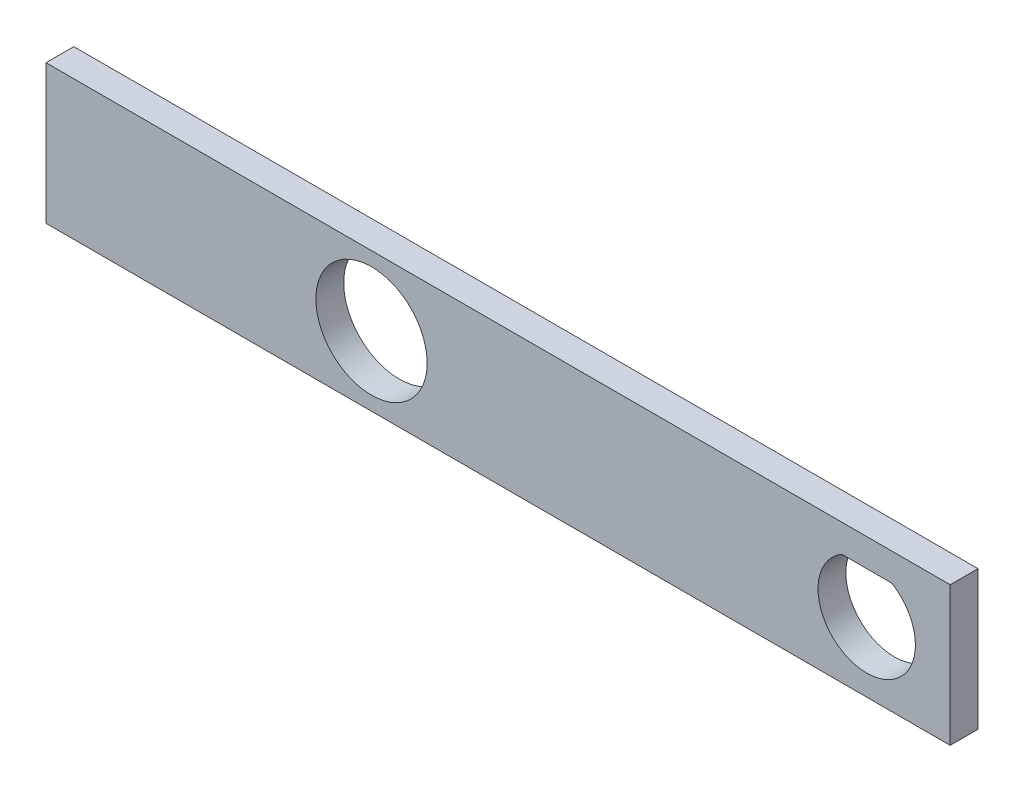
ISO-10303-21;
HEADER;
FILE_DESCRIPTION(('STEP AP214'),'2;1');
FILE_NAME('part.step','',(''),(''),'','','');
FILE_SCHEMA(('AUTOMOTIVE_DESIGN { 1 0 10303 214 1 1 1 1 }'));
ENDSEC;
DATA;
#1=APPLICATION_CONTEXT('core data for automotive mechanical design processes');
#2=APPLICATION_PROTOCOL_DEFINITION('international standard','automotive_design',2000,#1);
#3=PRODUCT_CONTEXT('',#1,'mechanical');
#4=PRODUCT('Part','Part','',(#3));
#5=PRODUCT_RELATED_PRODUCT_CATEGORY('part','',(#4));
#6=PRODUCT_DEFINITION_FORMATION('','',#4);
#7=PRODUCT_DEFINITION_CONTEXT('part definition',#1,'design');
#8=PRODUCT_DEFINITION('design','',#6,#7);
#9=PRODUCT_DEFINITION_SHAPE('','',#8);
#10=(LENGTH_UNIT() NAMED_UNIT(*) SI_UNIT(.MILLI.,.METRE.));
#11=(NAMED_UNIT(*) PLANE_ANGLE_UNIT() SI_UNIT($,.RADIAN.));
#12=(NAMED_UNIT(*) SI_UNIT($,.STERADIAN.) SOLID_ANGLE_UNIT());
#13=UNCERTAINTY_MEASURE_WITH_UNIT(LENGTH_MEASURE(1.E-05),#10,'distance_accuracy_value','');
#14=(GEOMETRIC_REPRESENTATION_CONTEXT(3) GLOBAL_UNCERTAINTY_ASSIGNED_CONTEXT((#13)) GLOBAL_UNIT_ASSIGNED_CONTEXT((#10,
#11,#12)) REPRESENTATION_CONTEXT('',''));
#15=CARTESIAN_POINT('',(0.,0.,0.));
#16=DIRECTION('',(0.,0.,1.));
#17=DIRECTION('',(1.,0.,0.));
#18=AXIS2_PLACEMENT_3D('',#15,#16,#17);
#19=CARTESIAN_POINT('',(0.,0.,2.));
#20=DIRECTION('',(0.,0.,1.));
#21=DIRECTION('',(1.,0.,0.));
#22=AXIS2_PLACEMENT_3D('',#19,#20,#21);
#23=PLANE('',#22);
#24=DIRECTION('',(0.,-1.,0.));
#25=VECTOR('',#24,1.);
#26=CARTESIAN_POINT('',(-23.4,5.,2.));
#27=LINE('',#26,#25);
#28=CARTESIAN_POINT('',(-23.4,5.,2.));
#29=VERTEX_POINT('',#28);
#30=CARTESIAN_POINT('',(-23.4,-5.,2.));
#31=VERTEX_POINT('',#30);
#32=EDGE_CURVE('E128',#29,#31,#27,.T.);
#33=ORIENTED_EDGE('',*,*,#32,.T.);
#34=DIRECTION('',(1.,0.,0.));
#35=VECTOR('',#34,1.);
#36=CARTESIAN_POINT('',(-23.4,-5.,2.));
#37=LINE('',#36,#35);
#38=CARTESIAN_POINT('',(41.6,-5.,2.));
#39=VERTEX_POINT('',#38);
#40=EDGE_CURVE('E132',#31,#39,#37,.T.);
#41=ORIENTED_EDGE('',*,*,#40,.T.);
#42=DIRECTION('',(0.,1.,0.));
#43=VECTOR('',#42,1.);
#44=CARTESIAN_POINT('',(41.6,5.,2.));
#45=LINE('',#44,#43);
#46=CARTESIAN_POINT('',(41.6,5.,2.));
#47=VERTEX_POINT('',#46);
#48=EDGE_CURVE('E136',#39,#47,#45,.T.);
#49=ORIENTED_EDGE('',*,*,#48,.T.);
#50=DIRECTION('',(-1.,0.,0.));
#51=VECTOR('',#50,1.);
#52=CARTESIAN_POINT('',(-23.4,5.,2.));
#53=LINE('',#52,#51);
#54=EDGE_CURVE('E139',#47,#29,#53,.T.);
#55=ORIENTED_EDGE('',*,*,#54,.T.);
#56=EDGE_LOOP('',(#33,#41,#49,#55));
#57=FACE_BOUND('',#56,.T.);
#58=CARTESIAN_POINT('',(0.,0.,2.));
#59=DIRECTION('',(0.,0.,1.));
#60=DIRECTION('',(1.,0.,0.));
#61=AXIS2_PLACEMENT_3D('',#58,#59,#60);
#62=CIRCLE('',#61,4.);
#63=CARTESIAN_POINT('',(4.,0.,2.));
#64=VERTEX_POINT('',#63);
#65=EDGE_CURVE('E120',#64,#64,#62,.T.);
#66=ORIENTED_EDGE('',*,*,#65,.F.);
#67=EDGE_LOOP('',(#66));
#68=FACE_BOUND('',#67,.T.);
#69=DIRECTION('',(-1.,0.,0.));
#70=VECTOR('',#69,1.);
#71=CARTESIAN_POINT('',(33.797224362268,3.,2.));
#72=LINE('',#71,#70);
#73=CARTESIAN_POINT('',(37.402775637732,3.,2.));
#74=VERTEX_POINT('',#73);
#75=CARTESIAN_POINT('',(33.797224362268,3.,2.));
#76=VERTEX_POINT('',#75);
#77=EDGE_CURVE('E97',#74,#76,#72,.T.);
#78=ORIENTED_EDGE('',*,*,#77,.F.);
#79=CARTESIAN_POINT('',(35.6,0.,2.));
#80=DIRECTION('',(0.,0.,1.));
#81=DIRECTION('',(1.,0.,0.));
#82=AXIS2_PLACEMENT_3D('',#79,#80,#81);
#83=CIRCLE('',#82,3.5);
#84=EDGE_CURVE('E104',#76,#74,#83,.T.);
#85=ORIENTED_EDGE('',*,*,#84,.F.);
#86=EDGE_LOOP('',(#78,#85));
#87=FACE_BOUND('',#86,.T.);
#88=ADVANCED_FACE('F44',(#57,#68,#87),#23,.T.);
#89=CARTESIAN_POINT('',(0.,0.,0.));
#90=DIRECTION('',(0.,0.,1.));
#91=DIRECTION('',(1.,0.,0.));
#92=AXIS2_PLACEMENT_3D('',#89,#90,#91);
#93=PLANE('',#92);
#94=CARTESIAN_POINT('',(0.,0.,0.));
#95=DIRECTION('',(0.,0.,1.));
#96=DIRECTION('',(1.,0.,0.));
#97=AXIS2_PLACEMENT_3D('',#94,#95,#96);
#98=CIRCLE('',#97,4.);
#99=CARTESIAN_POINT('',(4.,0.,0.));
#100=VERTEX_POINT('',#99);
#101=EDGE_CURVE('E119',#100,#100,#98,.T.);
#102=ORIENTED_EDGE('',*,*,#101,.T.);
#103=EDGE_LOOP('',(#102));
#104=FACE_BOUND('',#103,.T.);
#105=DIRECTION('',(0.,-1.,0.));
#106=VECTOR('',#105,1.);
#107=CARTESIAN_POINT('',(-23.4,5.,0.));
#108=LINE('',#107,#106);
#109=CARTESIAN_POINT('',(-23.4,5.,0.));
#110=VERTEX_POINT('',#109);
#111=CARTESIAN_POINT('',(-23.4,-5.,0.));
#112=VERTEX_POINT('',#111);
#113=EDGE_CURVE('E124',#110,#112,#108,.T.);
#114=ORIENTED_EDGE('',*,*,#113,.F.);
#115=DIRECTION('',(-1.,0.,0.));
#116=VECTOR('',#115,1.);
#117=CARTESIAN_POINT('',(-23.4,5.,0.));
#118=LINE('',#117,#116);
#119=CARTESIAN_POINT('',(41.6,5.,0.));
#120=VERTEX_POINT('',#119);
#121=EDGE_CURVE('E133',#120,#110,#118,.T.);
#122=ORIENTED_EDGE('',*,*,#121,.F.);
#123=DIRECTION('',(0.,1.,0.));
#124=VECTOR('',#123,1.);
#125=CARTESIAN_POINT('',(41.6,5.,0.));
#126=LINE('',#125,#124);
#127=CARTESIAN_POINT('',(41.6,-5.,0.));
#128=VERTEX_POINT('',#127);
#129=EDGE_CURVE('E149',#128,#120,#126,.T.);
#130=ORIENTED_EDGE('',*,*,#129,.F.);
#131=DIRECTION('',(1.,0.,0.));
#132=VECTOR('',#131,1.);
#133=CARTESIAN_POINT('',(-23.4,-5.,0.));
#134=LINE('',#133,#132);
#135=EDGE_CURVE('E146',#112,#128,#134,.T.);
#136=ORIENTED_EDGE('',*,*,#135,.F.);
#137=EDGE_LOOP('',(#114,#122,#130,#136));
#138=FACE_BOUND('',#137,.T.);
#139=CARTESIAN_POINT('',(35.6,0.,0.));
#140=DIRECTION('',(0.,0.,1.));
#141=DIRECTION('',(1.,0.,0.));
#142=AXIS2_PLACEMENT_3D('',#139,#140,#141);
#143=CIRCLE('',#142,3.5);
#144=CARTESIAN_POINT('',(33.797224362268,3.,0.));
#145=VERTEX_POINT('',#144);
#146=CARTESIAN_POINT('',(37.402775637732,3.,0.));
#147=VERTEX_POINT('',#146);
#148=EDGE_CURVE('E67',#145,#147,#143,.T.);
#149=ORIENTED_EDGE('',*,*,#148,.T.);
#150=DIRECTION('',(-1.,0.,0.));
#151=VECTOR('',#150,1.);
#152=CARTESIAN_POINT('',(33.797224362268,3.,0.));
#153=LINE('',#152,#151);
#154=EDGE_CURVE('E110',#147,#145,#153,.T.);
#155=ORIENTED_EDGE('',*,*,#154,.T.);
#156=EDGE_LOOP('',(#149,#155));
#157=FACE_BOUND('',#156,.T.);
#158=ADVANCED_FACE('F172',(#104,#138,#157),#93,.F.);
#159=CARTESIAN_POINT('',(-23.4,5.,2.));
#160=DIRECTION('',(1.,0.,0.));
#161=DIRECTION('',(0.,0.,-1.));
#162=AXIS2_PLACEMENT_3D('',#159,#160,#161);
#163=PLANE('',#162);
#164=ORIENTED_EDGE('',*,*,#113,.T.);
#165=DIRECTION('',(0.,0.,-1.));
#166=VECTOR('',#165,1.);
#167=CARTESIAN_POINT('',(-23.4,-5.,2.));
#168=LINE('',#167,#166);
#169=EDGE_CURVE('E11',#31,#112,#168,.T.);
#170=ORIENTED_EDGE('',*,*,#169,.F.);
#171=ORIENTED_EDGE('',*,*,#32,.F.);
#172=DIRECTION('',(0.,0.,-1.));
#173=VECTOR('',#172,1.);
#174=CARTESIAN_POINT('',(-23.4,5.,2.));
#175=LINE('',#174,#173);
#176=EDGE_CURVE('E142',#29,#110,#175,.T.);
#177=ORIENTED_EDGE('',*,*,#176,.T.);
#178=EDGE_LOOP('',(#164,#170,#171,#177));
#179=FACE_BOUND('',#178,.T.);
#180=ADVANCED_FACE('F46',(#179),#163,.F.);
#181=CARTESIAN_POINT('',(-23.4,-5.,2.));
#182=DIRECTION('',(0.,1.,0.));
#183=DIRECTION('',(0.,0.,1.));
#184=AXIS2_PLACEMENT_3D('',#181,#182,#183);
#185=PLANE('',#184);
#186=ORIENTED_EDGE('',*,*,#135,.T.);
#187=DIRECTION('',(0.,0.,-1.));
#188=VECTOR('',#187,1.);
#189=CARTESIAN_POINT('',(41.6,-5.,2.));
#190=LINE('',#189,#188);
#191=EDGE_CURVE('E53',#39,#128,#190,.T.);
#192=ORIENTED_EDGE('',*,*,#191,.F.);
#193=ORIENTED_EDGE('',*,*,#40,.F.);
#194=ORIENTED_EDGE('',*,*,#169,.T.);
#195=EDGE_LOOP('',(#186,#192,#193,#194));
#196=FACE_BOUND('',#195,.T.);
#197=ADVANCED_FACE('F183',(#196),#185,.F.);
#198=CARTESIAN_POINT('',(41.6,5.,2.));
#199=DIRECTION('',(-1.,0.,0.));
#200=DIRECTION('',(0.,0.,1.));
#201=AXIS2_PLACEMENT_3D('',#198,#199,#200);
#202=PLANE('',#201);
#203=ORIENTED_EDGE('',*,*,#129,.T.);
#204=DIRECTION('',(0.,0.,-1.));
#205=VECTOR('',#204,1.);
#206=CARTESIAN_POINT('',(41.6,5.,2.));
#207=LINE('',#206,#205);
#208=EDGE_CURVE('E157',#47,#120,#207,.T.);
#209=ORIENTED_EDGE('',*,*,#208,.F.);
#210=ORIENTED_EDGE('',*,*,#48,.F.);
#211=ORIENTED_EDGE('',*,*,#191,.T.);
#212=EDGE_LOOP('',(#203,#209,#210,#211));
#213=FACE_BOUND('',#212,.T.);
#214=ADVANCED_FACE('F166',(#213),#202,.F.);
#215=CARTESIAN_POINT('',(-23.4,5.,2.));
#216=DIRECTION('',(0.,-1.,0.));
#217=DIRECTION('',(0.,0.,-1.));
#218=AXIS2_PLACEMENT_3D('',#215,#216,#217);
#219=PLANE('',#218);
#220=ORIENTED_EDGE('',*,*,#121,.T.);
#221=ORIENTED_EDGE('',*,*,#176,.F.);
#222=ORIENTED_EDGE('',*,*,#54,.F.);
#223=ORIENTED_EDGE('',*,*,#208,.T.);
#224=EDGE_LOOP('',(#220,#221,#222,#223));
#225=FACE_BOUND('',#224,.T.);
#226=ADVANCED_FACE('F176',(#225),#219,.F.);
#227=CARTESIAN_POINT('',(0.,0.,2.));
#228=DIRECTION('',(0.,0.,-1.));
#229=DIRECTION('',(-1.,0.,0.));
#230=AXIS2_PLACEMENT_3D('',#227,#228,#229);
#231=CYLINDRICAL_SURFACE('',#230,4.);
#232=ORIENTED_EDGE('',*,*,#65,.T.);
#233=EDGE_LOOP('',(#232));
#234=FACE_BOUND('',#233,.T.);
#235=ORIENTED_EDGE('',*,*,#101,.F.);
#236=EDGE_LOOP('',(#235));
#237=FACE_BOUND('',#236,.T.);
#238=ADVANCED_FACE('F198',(#234,#237),#231,.F.);
#239=CARTESIAN_POINT('',(35.6,0.,2.));
#240=DIRECTION('',(0.,0.,-1.));
#241=DIRECTION('',(-1.,0.,0.));
#242=AXIS2_PLACEMENT_3D('',#239,#240,#241);
#243=CYLINDRICAL_SURFACE('',#242,3.5);
#244=ORIENTED_EDGE('',*,*,#148,.F.);
#245=DIRECTION('',(0.,0.,-1.));
#246=VECTOR('',#245,1.);
#247=CARTESIAN_POINT('',(33.797224362268,3.,2.));
#248=LINE('',#247,#246);
#249=EDGE_CURVE('E99',#76,#145,#248,.T.);
#250=ORIENTED_EDGE('',*,*,#249,.F.);
#251=ORIENTED_EDGE('',*,*,#84,.T.);
#252=DIRECTION('',(0.,0.,-1.));
#253=VECTOR('',#252,1.);
#254=CARTESIAN_POINT('',(37.402775637732,3.,2.));
#255=LINE('',#254,#253);
#256=EDGE_CURVE('E60',#74,#147,#255,.T.);
#257=ORIENTED_EDGE('',*,*,#256,.T.);
#258=EDGE_LOOP('',(#244,#250,#251,#257));
#259=FACE_BOUND('',#258,.T.);
#260=ADVANCED_FACE('F106',(#259),#243,.F.);
#261=CARTESIAN_POINT('',(33.797224362268,3.,2.));
#262=DIRECTION('',(0.,-1.,0.));
#263=DIRECTION('',(0.,0.,-1.));
#264=AXIS2_PLACEMENT_3D('',#261,#262,#263);
#265=PLANE('',#264);
#266=ORIENTED_EDGE('',*,*,#154,.F.);
#267=ORIENTED_EDGE('',*,*,#256,.F.);
#268=ORIENTED_EDGE('',*,*,#77,.T.);
#269=ORIENTED_EDGE('',*,*,#249,.T.);
#270=EDGE_LOOP('',(#266,#267,#268,#269));
#271=FACE_BOUND('',#270,.T.);
#272=ADVANCED_FACE('F98',(#271),#265,.T.);
#273=CLOSED_SHELL('',(#88,#158,#180,#197,#214,#226,#238,#260,#272));
#274=MANIFOLD_SOLID_BREP('B2',#273);
#275=ADVANCED_BREP_SHAPE_REPRESENTATION('',(#18,#274),#14);
#276=SHAPE_DEFINITION_REPRESENTATION(#9,#275);
ENDSEC;
END-ISO-10303-21;
